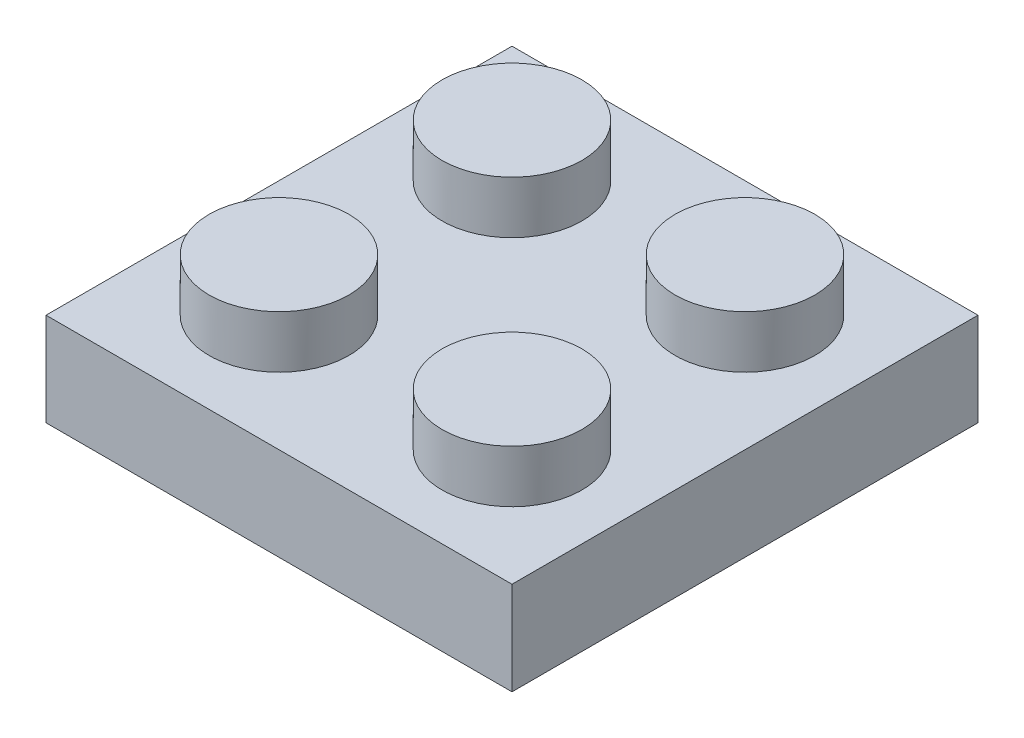
ISO-10303-21;
HEADER;
FILE_DESCRIPTION(('STEP AP214'),'2;1');
FILE_NAME('part.step','',(''),(''),'','','');
FILE_SCHEMA(('AUTOMOTIVE_DESIGN { 1 0 10303 214 1 1 1 1 }'));
ENDSEC;
DATA;
#1=APPLICATION_CONTEXT('core data for automotive mechanical design processes');
#2=APPLICATION_PROTOCOL_DEFINITION('international standard','automotive_design',2000,#1);
#3=PRODUCT_CONTEXT('',#1,'mechanical');
#4=PRODUCT('Part','Part','',(#3));
#5=PRODUCT_RELATED_PRODUCT_CATEGORY('part','',(#4));
#6=PRODUCT_DEFINITION_FORMATION('','',#4);
#7=PRODUCT_DEFINITION_CONTEXT('part definition',#1,'design');
#8=PRODUCT_DEFINITION('design','',#6,#7);
#9=PRODUCT_DEFINITION_SHAPE('','',#8);
#10=(LENGTH_UNIT() NAMED_UNIT(*) SI_UNIT(.MILLI.,.METRE.));
#11=(NAMED_UNIT(*) PLANE_ANGLE_UNIT() SI_UNIT($,.RADIAN.));
#12=(NAMED_UNIT(*) SI_UNIT($,.STERADIAN.) SOLID_ANGLE_UNIT());
#13=UNCERTAINTY_MEASURE_WITH_UNIT(LENGTH_MEASURE(1.E-05),#10,'distance_accuracy_value','');
#14=(GEOMETRIC_REPRESENTATION_CONTEXT(3) GLOBAL_UNCERTAINTY_ASSIGNED_CONTEXT((#13)) GLOBAL_UNIT_ASSIGNED_CONTEXT((#10,
#11,#12)) REPRESENTATION_CONTEXT('',''));
#15=CARTESIAN_POINT('',(0.,0.,0.));
#16=DIRECTION('',(0.,0.,1.));
#17=DIRECTION('',(1.,0.,0.));
#18=AXIS2_PLACEMENT_3D('',#15,#16,#17);
#19=CARTESIAN_POINT('',(0.,3.2,0.));
#20=DIRECTION('',(1.,0.,0.));
#21=DIRECTION('',(0.,0.,-1.));
#22=AXIS2_PLACEMENT_3D('',#19,#20,#21);
#23=PLANE('',#22);
#24=DIRECTION('',(0.,0.,1.));
#25=VECTOR('',#24,1.);
#26=CARTESIAN_POINT('',(0.,0.,0.));
#27=LINE('',#26,#25);
#28=CARTESIAN_POINT('',(0.,0.,-16.));
#29=VERTEX_POINT('',#28);
#30=CARTESIAN_POINT('',(0.,0.,0.));
#31=VERTEX_POINT('',#30);
#32=EDGE_CURVE('E187',#29,#31,#27,.T.);
#33=ORIENTED_EDGE('',*,*,#32,.T.);
#34=DIRECTION('',(0.,-1.,0.));
#35=VECTOR('',#34,1.);
#36=CARTESIAN_POINT('',(0.,3.2,0.));
#37=LINE('',#36,#35);
#38=CARTESIAN_POINT('',(0.,3.2,0.));
#39=VERTEX_POINT('',#38);
#40=EDGE_CURVE('E219',#39,#31,#37,.T.);
#41=ORIENTED_EDGE('',*,*,#40,.F.);
#42=DIRECTION('',(0.,0.,1.));
#43=VECTOR('',#42,1.);
#44=CARTESIAN_POINT('',(0.,3.2,0.));
#45=LINE('',#44,#43);
#46=CARTESIAN_POINT('',(0.,3.2,-16.));
#47=VERTEX_POINT('',#46);
#48=EDGE_CURVE('E188',#47,#39,#45,.T.);
#49=ORIENTED_EDGE('',*,*,#48,.F.);
#50=DIRECTION('',(0.,-1.,0.));
#51=VECTOR('',#50,1.);
#52=CARTESIAN_POINT('',(0.,3.2,-16.));
#53=LINE('',#52,#51);
#54=EDGE_CURVE('E198',#47,#29,#53,.T.);
#55=ORIENTED_EDGE('',*,*,#54,.T.);
#56=EDGE_LOOP('',(#33,#41,#49,#55));
#57=FACE_BOUND('',#56,.T.);
#58=ADVANCED_FACE('F42',(#57),#23,.F.);
#59=CARTESIAN_POINT('',(0.,3.2,0.));
#60=DIRECTION('',(0.,0.,-1.));
#61=DIRECTION('',(-1.,0.,0.));
#62=AXIS2_PLACEMENT_3D('',#59,#60,#61);
#63=PLANE('',#62);
#64=DIRECTION('',(1.,0.,0.));
#65=VECTOR('',#64,1.);
#66=CARTESIAN_POINT('',(0.,0.,0.));
#67=LINE('',#66,#65);
#68=CARTESIAN_POINT('',(16.,0.,0.));
#69=VERTEX_POINT('',#68);
#70=EDGE_CURVE('E202',#31,#69,#67,.T.);
#71=ORIENTED_EDGE('',*,*,#70,.T.);
#72=DIRECTION('',(0.,-1.,0.));
#73=VECTOR('',#72,1.);
#74=CARTESIAN_POINT('',(16.,3.2,0.));
#75=LINE('',#74,#73);
#76=CARTESIAN_POINT('',(16.,3.2,0.));
#77=VERTEX_POINT('',#76);
#78=EDGE_CURVE('E215',#77,#69,#75,.T.);
#79=ORIENTED_EDGE('',*,*,#78,.F.);
#80=DIRECTION('',(1.,0.,0.));
#81=VECTOR('',#80,1.);
#82=CARTESIAN_POINT('',(0.,3.2,0.));
#83=LINE('',#82,#81);
#84=EDGE_CURVE('E95',#39,#77,#83,.T.);
#85=ORIENTED_EDGE('',*,*,#84,.F.);
#86=ORIENTED_EDGE('',*,*,#40,.T.);
#87=EDGE_LOOP('',(#71,#79,#85,#86));
#88=FACE_BOUND('',#87,.T.);
#89=ADVANCED_FACE('F249',(#88),#63,.F.);
#90=CARTESIAN_POINT('',(16.,3.2,0.));
#91=DIRECTION('',(-1.,0.,0.));
#92=DIRECTION('',(0.,0.,1.));
#93=AXIS2_PLACEMENT_3D('',#90,#91,#92);
#94=PLANE('',#93);
#95=DIRECTION('',(0.,0.,-1.));
#96=VECTOR('',#95,1.);
#97=CARTESIAN_POINT('',(16.,0.,0.));
#98=LINE('',#97,#96);
#99=CARTESIAN_POINT('',(16.,0.,-16.));
#100=VERTEX_POINT('',#99);
#101=EDGE_CURVE('E205',#69,#100,#98,.T.);
#102=ORIENTED_EDGE('',*,*,#101,.T.);
#103=DIRECTION('',(0.,-1.,0.));
#104=VECTOR('',#103,1.);
#105=CARTESIAN_POINT('',(16.,3.2,-16.));
#106=LINE('',#105,#104);
#107=CARTESIAN_POINT('',(16.,3.2,-16.));
#108=VERTEX_POINT('',#107);
#109=EDGE_CURVE('E212',#108,#100,#106,.T.);
#110=ORIENTED_EDGE('',*,*,#109,.F.);
#111=DIRECTION('',(0.,0.,-1.));
#112=VECTOR('',#111,1.);
#113=CARTESIAN_POINT('',(16.,3.2,0.));
#114=LINE('',#113,#112);
#115=EDGE_CURVE('E193',#77,#108,#114,.T.);
#116=ORIENTED_EDGE('',*,*,#115,.F.);
#117=ORIENTED_EDGE('',*,*,#78,.T.);
#118=EDGE_LOOP('',(#102,#110,#116,#117));
#119=FACE_BOUND('',#118,.T.);
#120=ADVANCED_FACE('F254',(#119),#94,.F.);
#121=CARTESIAN_POINT('',(0.,3.2,-16.));
#122=DIRECTION('',(0.,0.,1.));
#123=DIRECTION('',(1.,0.,0.));
#124=AXIS2_PLACEMENT_3D('',#121,#122,#123);
#125=PLANE('',#124);
#126=DIRECTION('',(-1.,0.,0.));
#127=VECTOR('',#126,1.);
#128=CARTESIAN_POINT('',(0.,0.,-16.));
#129=LINE('',#128,#127);
#130=EDGE_CURVE('E87',#100,#29,#129,.T.);
#131=ORIENTED_EDGE('',*,*,#130,.T.);
#132=ORIENTED_EDGE('',*,*,#54,.F.);
#133=DIRECTION('',(-1.,0.,0.));
#134=VECTOR('',#133,1.);
#135=CARTESIAN_POINT('',(0.,3.2,-16.));
#136=LINE('',#135,#134);
#137=EDGE_CURVE('E66',#108,#47,#136,.T.);
#138=ORIENTED_EDGE('',*,*,#137,.F.);
#139=ORIENTED_EDGE('',*,*,#109,.T.);
#140=EDGE_LOOP('',(#131,#132,#138,#139));
#141=FACE_BOUND('',#140,.T.);
#142=ADVANCED_FACE('F239',(#141),#125,.F.);
#143=CARTESIAN_POINT('',(0.,3.2,0.));
#144=DIRECTION('',(0.,-1.,0.));
#145=DIRECTION('',(0.,0.,-1.));
#146=AXIS2_PLACEMENT_3D('',#143,#144,#145);
#147=PLANE('',#146);
#148=CARTESIAN_POINT('',(3.99999999999999,3.2,-4.));
#149=DIRECTION('',(0.,-1.,0.));
#150=DIRECTION('',(0.,0.,-1.));
#151=AXIS2_PLACEMENT_3D('',#148,#149,#150);
#152=CIRCLE('',#151,2.4);
#153=CARTESIAN_POINT('',(3.99999999999999,3.2,-6.4));
#154=VERTEX_POINT('',#153);
#155=EDGE_CURVE('E11',#154,#154,#152,.F.);
#156=ORIENTED_EDGE('',*,*,#155,.F.);
#157=EDGE_LOOP('',(#156));
#158=FACE_BOUND('',#157,.T.);
#159=CARTESIAN_POINT('',(12.,3.2,-4.));
#160=DIRECTION('',(0.,-1.,0.));
#161=DIRECTION('',(0.,0.,-1.));
#162=AXIS2_PLACEMENT_3D('',#159,#160,#161);
#163=CIRCLE('',#162,2.4);
#164=CARTESIAN_POINT('',(12.,3.2,-6.4));
#165=VERTEX_POINT('',#164);
#166=EDGE_CURVE('E50',#165,#165,#163,.F.);
#167=ORIENTED_EDGE('',*,*,#166,.F.);
#168=EDGE_LOOP('',(#167));
#169=FACE_BOUND('',#168,.T.);
#170=CARTESIAN_POINT('',(12.,3.2,-12.));
#171=DIRECTION('',(0.,-1.,0.));
#172=DIRECTION('',(0.,0.,-1.));
#173=AXIS2_PLACEMENT_3D('',#170,#171,#172);
#174=CIRCLE('',#173,2.4);
#175=CARTESIAN_POINT('',(12.,3.2,-14.4));
#176=VERTEX_POINT('',#175);
#177=EDGE_CURVE('E226',#176,#176,#174,.F.);
#178=ORIENTED_EDGE('',*,*,#177,.F.);
#179=EDGE_LOOP('',(#178));
#180=FACE_BOUND('',#179,.T.);
#181=CARTESIAN_POINT('',(3.99999999999999,3.2,-12.));
#182=DIRECTION('',(0.,-1.,0.));
#183=DIRECTION('',(0.,0.,-1.));
#184=AXIS2_PLACEMENT_3D('',#181,#182,#183);
#185=CIRCLE('',#184,2.4);
#186=CARTESIAN_POINT('',(3.99999999999999,3.2,-14.4));
#187=VERTEX_POINT('',#186);
#188=EDGE_CURVE('E222',#187,#187,#185,.F.);
#189=ORIENTED_EDGE('',*,*,#188,.F.);
#190=EDGE_LOOP('',(#189));
#191=FACE_BOUND('',#190,.T.);
#192=ORIENTED_EDGE('',*,*,#48,.T.);
#193=ORIENTED_EDGE('',*,*,#84,.T.);
#194=ORIENTED_EDGE('',*,*,#115,.T.);
#195=ORIENTED_EDGE('',*,*,#137,.T.);
#196=EDGE_LOOP('',(#192,#193,#194,#195));
#197=FACE_BOUND('',#196,.T.);
#198=ADVANCED_FACE('F235',(#158,#169,#180,#191,#197),#147,.F.);
#199=CARTESIAN_POINT('',(0.,0.,0.));
#200=DIRECTION('',(0.,-1.,0.));
#201=DIRECTION('',(0.,0.,-1.));
#202=AXIS2_PLACEMENT_3D('',#199,#200,#201);
#203=PLANE('',#202);
#204=DIRECTION('',(0.,0.,-1.));
#205=VECTOR('',#204,1.);
#206=CARTESIAN_POINT('',(1.59999999999999,0.,-1.6));
#207=LINE('',#206,#205);
#208=CARTESIAN_POINT('',(1.59999999999999,0.,-1.6));
#209=VERTEX_POINT('',#208);
#210=CARTESIAN_POINT('',(1.59999999999999,0.,-14.4));
#211=VERTEX_POINT('',#210);
#212=EDGE_CURVE('E57',#209,#211,#207,.T.);
#213=ORIENTED_EDGE('',*,*,#212,.F.);
#214=DIRECTION('',(-1.,0.,0.));
#215=VECTOR('',#214,1.);
#216=CARTESIAN_POINT('',(1.59999999999999,0.,-1.6));
#217=LINE('',#216,#215);
#218=CARTESIAN_POINT('',(14.4,0.,-1.6));
#219=VERTEX_POINT('',#218);
#220=EDGE_CURVE('E140',#219,#209,#217,.T.);
#221=ORIENTED_EDGE('',*,*,#220,.F.);
#222=DIRECTION('',(0.,0.,1.));
#223=VECTOR('',#222,1.);
#224=CARTESIAN_POINT('',(14.4,0.,-1.6));
#225=LINE('',#224,#223);
#226=CARTESIAN_POINT('',(14.4,0.,-14.4));
#227=VERTEX_POINT('',#226);
#228=EDGE_CURVE('E144',#227,#219,#225,.T.);
#229=ORIENTED_EDGE('',*,*,#228,.F.);
#230=DIRECTION('',(1.,0.,0.));
#231=VECTOR('',#230,1.);
#232=CARTESIAN_POINT('',(1.59999999999999,0.,-14.4));
#233=LINE('',#232,#231);
#234=EDGE_CURVE('E156',#211,#227,#233,.T.);
#235=ORIENTED_EDGE('',*,*,#234,.F.);
#236=EDGE_LOOP('',(#213,#221,#229,#235));
#237=FACE_BOUND('',#236,.T.);
#238=ORIENTED_EDGE('',*,*,#32,.F.);
#239=ORIENTED_EDGE('',*,*,#130,.F.);
#240=ORIENTED_EDGE('',*,*,#101,.F.);
#241=ORIENTED_EDGE('',*,*,#70,.F.);
#242=EDGE_LOOP('',(#238,#239,#240,#241));
#243=FACE_BOUND('',#242,.T.);
#244=ADVANCED_FACE('F238',(#237,#243),#203,.T.);
#245=CARTESIAN_POINT('',(3.99999999999999,5.,-12.));
#246=DIRECTION('',(0.,-1.,0.));
#247=DIRECTION('',(0.,0.,-1.));
#248=AXIS2_PLACEMENT_3D('',#245,#246,#247);
#249=CYLINDRICAL_SURFACE('',#248,2.4);
#250=CARTESIAN_POINT('',(3.99999999999999,5.,-12.));
#251=DIRECTION('',(0.,1.,0.));
#252=DIRECTION('',(0.,0.,1.));
#253=AXIS2_PLACEMENT_3D('',#250,#251,#252);
#254=CIRCLE('',#253,2.4);
#255=CARTESIAN_POINT('',(3.99999999999999,5.,-9.6));
#256=VERTEX_POINT('',#255);
#257=EDGE_CURVE('E183',#256,#256,#254,.T.);
#258=ORIENTED_EDGE('',*,*,#257,.F.);
#259=EDGE_LOOP('',(#258));
#260=FACE_BOUND('',#259,.T.);
#261=ORIENTED_EDGE('',*,*,#188,.T.);
#262=EDGE_LOOP('',(#261));
#263=FACE_BOUND('',#262,.T.);
#264=ADVANCED_FACE('F257',(#260,#263),#249,.T.);
#265=CARTESIAN_POINT('',(3.99999999999999,5.,-12.));
#266=DIRECTION('',(0.,1.,0.));
#267=DIRECTION('',(0.,0.,1.));
#268=AXIS2_PLACEMENT_3D('',#265,#266,#267);
#269=PLANE('',#268);
#270=ORIENTED_EDGE('',*,*,#257,.T.);
#271=EDGE_LOOP('',(#270));
#272=FACE_BOUND('',#271,.T.);
#273=ADVANCED_FACE('F263',(#272),#269,.T.);
#274=CARTESIAN_POINT('',(12.,5.,-12.));
#275=DIRECTION('',(0.,-1.,0.));
#276=DIRECTION('',(0.,0.,-1.));
#277=AXIS2_PLACEMENT_3D('',#274,#275,#276);
#278=CYLINDRICAL_SURFACE('',#277,2.4);
#279=CARTESIAN_POINT('',(12.,5.,-12.));
#280=DIRECTION('',(0.,1.,0.));
#281=DIRECTION('',(0.,0.,1.));
#282=AXIS2_PLACEMENT_3D('',#279,#280,#281);
#283=CIRCLE('',#282,2.4);
#284=CARTESIAN_POINT('',(12.,5.,-9.6));
#285=VERTEX_POINT('',#284);
#286=EDGE_CURVE('E179',#285,#285,#283,.T.);
#287=ORIENTED_EDGE('',*,*,#286,.F.);
#288=EDGE_LOOP('',(#287));
#289=FACE_BOUND('',#288,.T.);
#290=ORIENTED_EDGE('',*,*,#177,.T.);
#291=EDGE_LOOP('',(#290));
#292=FACE_BOUND('',#291,.T.);
#293=ADVANCED_FACE('F302',(#289,#292),#278,.T.);
#294=CARTESIAN_POINT('',(12.,5.,-12.));
#295=DIRECTION('',(0.,1.,0.));
#296=DIRECTION('',(0.,0.,1.));
#297=AXIS2_PLACEMENT_3D('',#294,#295,#296);
#298=PLANE('',#297);
#299=ORIENTED_EDGE('',*,*,#286,.T.);
#300=EDGE_LOOP('',(#299));
#301=FACE_BOUND('',#300,.T.);
#302=ADVANCED_FACE('F313',(#301),#298,.T.);
#303=CARTESIAN_POINT('',(12.,5.,-4.));
#304=DIRECTION('',(0.,-1.,0.));
#305=DIRECTION('',(0.,0.,-1.));
#306=AXIS2_PLACEMENT_3D('',#303,#304,#305);
#307=CYLINDRICAL_SURFACE('',#306,2.4);
#308=CARTESIAN_POINT('',(12.,5.,-4.));
#309=DIRECTION('',(0.,1.,0.));
#310=DIRECTION('',(0.,0.,1.));
#311=AXIS2_PLACEMENT_3D('',#308,#309,#310);
#312=CIRCLE('',#311,2.4);
#313=CARTESIAN_POINT('',(12.,5.,-1.6));
#314=VERTEX_POINT('',#313);
#315=EDGE_CURVE('E175',#314,#314,#312,.T.);
#316=ORIENTED_EDGE('',*,*,#315,.F.);
#317=EDGE_LOOP('',(#316));
#318=FACE_BOUND('',#317,.T.);
#319=ORIENTED_EDGE('',*,*,#166,.T.);
#320=EDGE_LOOP('',(#319));
#321=FACE_BOUND('',#320,.T.);
#322=ADVANCED_FACE('F233',(#318,#321),#307,.T.);
#323=CARTESIAN_POINT('',(12.,5.,-4.));
#324=DIRECTION('',(0.,1.,0.));
#325=DIRECTION('',(0.,0.,1.));
#326=AXIS2_PLACEMENT_3D('',#323,#324,#325);
#327=PLANE('',#326);
#328=ORIENTED_EDGE('',*,*,#315,.T.);
#329=EDGE_LOOP('',(#328));
#330=FACE_BOUND('',#329,.T.);
#331=ADVANCED_FACE('F334',(#330),#327,.T.);
#332=CARTESIAN_POINT('',(3.99999999999999,5.,-4.));
#333=DIRECTION('',(0.,-1.,0.));
#334=DIRECTION('',(0.,0.,-1.));
#335=AXIS2_PLACEMENT_3D('',#332,#333,#334);
#336=CYLINDRICAL_SURFACE('',#335,2.4);
#337=CARTESIAN_POINT('',(3.99999999999999,5.,-4.));
#338=DIRECTION('',(0.,1.,0.));
#339=DIRECTION('',(0.,0.,1.));
#340=AXIS2_PLACEMENT_3D('',#337,#338,#339);
#341=CIRCLE('',#340,2.4);
#342=CARTESIAN_POINT('',(3.99999999999999,5.,-1.6));
#343=VERTEX_POINT('',#342);
#344=EDGE_CURVE('E166',#343,#343,#341,.T.);
#345=ORIENTED_EDGE('',*,*,#344,.F.);
#346=EDGE_LOOP('',(#345));
#347=FACE_BOUND('',#346,.T.);
#348=ORIENTED_EDGE('',*,*,#155,.T.);
#349=EDGE_LOOP('',(#348));
#350=FACE_BOUND('',#349,.T.);
#351=ADVANCED_FACE('F345',(#347,#350),#336,.T.);
#352=CARTESIAN_POINT('',(3.99999999999999,5.,-4.));
#353=DIRECTION('',(0.,1.,0.));
#354=DIRECTION('',(0.,0.,1.));
#355=AXIS2_PLACEMENT_3D('',#352,#353,#354);
#356=PLANE('',#355);
#357=ORIENTED_EDGE('',*,*,#344,.T.);
#358=EDGE_LOOP('',(#357));
#359=FACE_BOUND('',#358,.T.);
#360=ADVANCED_FACE('F356',(#359),#356,.T.);
#361=CARTESIAN_POINT('',(1.59999999999999,1.8,-1.6));
#362=DIRECTION('',(-1.,0.,0.));
#363=DIRECTION('',(0.,0.,1.));
#364=AXIS2_PLACEMENT_3D('',#361,#362,#363);
#365=PLANE('',#364);
#366=ORIENTED_EDGE('',*,*,#212,.T.);
#367=DIRECTION('',(0.,-1.,0.));
#368=VECTOR('',#367,1.);
#369=CARTESIAN_POINT('',(1.59999999999999,1.8,-14.4));
#370=LINE('',#369,#368);
#371=CARTESIAN_POINT('',(1.59999999999999,1.8,-14.4));
#372=VERTEX_POINT('',#371);
#373=EDGE_CURVE('E115',#372,#211,#370,.T.);
#374=ORIENTED_EDGE('',*,*,#373,.F.);
#375=DIRECTION('',(0.,0.,-1.));
#376=VECTOR('',#375,1.);
#377=CARTESIAN_POINT('',(1.59999999999999,1.8,-1.6));
#378=LINE('',#377,#376);
#379=CARTESIAN_POINT('',(1.59999999999999,1.8,-1.6));
#380=VERTEX_POINT('',#379);
#381=EDGE_CURVE('E119',#380,#372,#378,.T.);
#382=ORIENTED_EDGE('',*,*,#381,.F.);
#383=DIRECTION('',(0.,-1.,0.));
#384=VECTOR('',#383,1.);
#385=CARTESIAN_POINT('',(1.59999999999999,1.8,-1.6));
#386=LINE('',#385,#384);
#387=EDGE_CURVE('E163',#380,#209,#386,.T.);
#388=ORIENTED_EDGE('',*,*,#387,.T.);
#389=EDGE_LOOP('',(#366,#374,#382,#388));
#390=FACE_BOUND('',#389,.T.);
#391=ADVANCED_FACE('F117',(#390),#365,.F.);
#392=CARTESIAN_POINT('',(1.59999999999999,1.8,-1.6));
#393=DIRECTION('',(0.,0.,1.));
#394=DIRECTION('',(1.,0.,0.));
#395=AXIS2_PLACEMENT_3D('',#392,#393,#394);
#396=PLANE('',#395);
#397=ORIENTED_EDGE('',*,*,#220,.T.);
#398=ORIENTED_EDGE('',*,*,#387,.F.);
#399=DIRECTION('',(-1.,0.,0.));
#400=VECTOR('',#399,1.);
#401=CARTESIAN_POINT('',(1.59999999999999,1.8,-1.6));
#402=LINE('',#401,#400);
#403=CARTESIAN_POINT('',(14.4,1.8,-1.6));
#404=VERTEX_POINT('',#403);
#405=EDGE_CURVE('E126',#404,#380,#402,.T.);
#406=ORIENTED_EDGE('',*,*,#405,.F.);
#407=DIRECTION('',(0.,-1.,0.));
#408=VECTOR('',#407,1.);
#409=CARTESIAN_POINT('',(14.4,1.8,-1.6));
#410=LINE('',#409,#408);
#411=EDGE_CURVE('E167',#404,#219,#410,.T.);
#412=ORIENTED_EDGE('',*,*,#411,.T.);
#413=EDGE_LOOP('',(#397,#398,#406,#412));
#414=FACE_BOUND('',#413,.T.);
#415=ADVANCED_FACE('F381',(#414),#396,.F.);
#416=CARTESIAN_POINT('',(14.4,1.8,-1.6));
#417=DIRECTION('',(1.,0.,0.));
#418=DIRECTION('',(0.,0.,-1.));
#419=AXIS2_PLACEMENT_3D('',#416,#417,#418);
#420=PLANE('',#419);
#421=ORIENTED_EDGE('',*,*,#228,.T.);
#422=ORIENTED_EDGE('',*,*,#411,.F.);
#423=DIRECTION('',(0.,0.,1.));
#424=VECTOR('',#423,1.);
#425=CARTESIAN_POINT('',(14.4,1.8,-1.6));
#426=LINE('',#425,#424);
#427=CARTESIAN_POINT('',(14.4,1.8,-14.4));
#428=VERTEX_POINT('',#427);
#429=EDGE_CURVE('E135',#428,#404,#426,.T.);
#430=ORIENTED_EDGE('',*,*,#429,.F.);
#431=DIRECTION('',(0.,-1.,0.));
#432=VECTOR('',#431,1.);
#433=CARTESIAN_POINT('',(14.4,1.8,-14.4));
#434=LINE('',#433,#432);
#435=EDGE_CURVE('E125',#428,#227,#434,.T.);
#436=ORIENTED_EDGE('',*,*,#435,.T.);
#437=EDGE_LOOP('',(#421,#422,#430,#436));
#438=FACE_BOUND('',#437,.T.);
#439=ADVANCED_FACE('F391',(#438),#420,.F.);
#440=CARTESIAN_POINT('',(1.59999999999999,1.8,-14.4));
#441=DIRECTION('',(0.,0.,-1.));
#442=DIRECTION('',(-1.,0.,0.));
#443=AXIS2_PLACEMENT_3D('',#440,#441,#442);
#444=PLANE('',#443);
#445=ORIENTED_EDGE('',*,*,#234,.T.);
#446=ORIENTED_EDGE('',*,*,#435,.F.);
#447=DIRECTION('',(1.,0.,0.));
#448=VECTOR('',#447,1.);
#449=CARTESIAN_POINT('',(1.59999999999999,1.8,-14.4));
#450=LINE('',#449,#448);
#451=EDGE_CURVE('E129',#372,#428,#450,.T.);
#452=ORIENTED_EDGE('',*,*,#451,.F.);
#453=ORIENTED_EDGE('',*,*,#373,.T.);
#454=EDGE_LOOP('',(#445,#446,#452,#453));
#455=FACE_BOUND('',#454,.T.);
#456=ADVANCED_FACE('F130',(#455),#444,.F.);
#457=CARTESIAN_POINT('',(0.,1.8,0.));
#458=DIRECTION('',(0.,-1.,0.));
#459=DIRECTION('',(0.,0.,-1.));
#460=AXIS2_PLACEMENT_3D('',#457,#458,#459);
#461=PLANE('',#460);
#462=CARTESIAN_POINT('',(7.99999999999999,1.8,-8.));
#463=DIRECTION('',(0.,-1.,0.));
#464=DIRECTION('',(0.,0.,-1.));
#465=AXIS2_PLACEMENT_3D('',#462,#463,#464);
#466=CIRCLE('',#465,3.25685425);
#467=CARTESIAN_POINT('',(7.99999999999999,1.8,-11.25685425));
#468=VERTEX_POINT('',#467);
#469=EDGE_CURVE('E147',#468,#468,#466,.T.);
#470=ORIENTED_EDGE('',*,*,#469,.F.);
#471=EDGE_LOOP('',(#470));
#472=FACE_BOUND('',#471,.T.);
#473=ORIENTED_EDGE('',*,*,#381,.T.);
#474=ORIENTED_EDGE('',*,*,#451,.T.);
#475=ORIENTED_EDGE('',*,*,#429,.T.);
#476=ORIENTED_EDGE('',*,*,#405,.T.);
#477=EDGE_LOOP('',(#473,#474,#475,#476));
#478=FACE_BOUND('',#477,.T.);
#479=ADVANCED_FACE('F137',(#472,#478),#461,.T.);
#480=CARTESIAN_POINT('',(7.99999999999999,0.,-8.));
#481=DIRECTION('',(0.,1.,0.));
#482=DIRECTION('',(0.,0.,1.));
#483=AXIS2_PLACEMENT_3D('',#480,#481,#482);
#484=CYLINDRICAL_SURFACE('',#483,3.25685425);
#485=CARTESIAN_POINT('',(7.99999999999999,0.,-8.));
#486=DIRECTION('',(0.,-1.,0.));
#487=DIRECTION('',(0.,0.,-1.));
#488=AXIS2_PLACEMENT_3D('',#485,#486,#487);
#489=CIRCLE('',#488,3.25685425);
#490=CARTESIAN_POINT('',(7.99999999999999,0.,-11.25685425));
#491=VERTEX_POINT('',#490);
#492=EDGE_CURVE('E157',#491,#491,#489,.T.);
#493=ORIENTED_EDGE('',*,*,#492,.F.);
#494=EDGE_LOOP('',(#493));
#495=FACE_BOUND('',#494,.T.);
#496=ORIENTED_EDGE('',*,*,#469,.T.);
#497=EDGE_LOOP('',(#496));
#498=FACE_BOUND('',#497,.T.);
#499=ADVANCED_FACE('F421',(#495,#498),#484,.T.);
#500=CARTESIAN_POINT('',(7.99999999999999,0.,-8.));
#501=DIRECTION('',(0.,-1.,0.));
#502=DIRECTION('',(0.,0.,-1.));
#503=AXIS2_PLACEMENT_3D('',#500,#501,#502);
#504=PLANE('',#503);
#505=CARTESIAN_POINT('',(7.99999999999999,0.,-8.));
#506=DIRECTION('',(0.,-1.,0.));
#507=DIRECTION('',(0.,0.,-1.));
#508=AXIS2_PLACEMENT_3D('',#505,#506,#507);
#509=CIRCLE('',#508,2.45685425);
#510=CARTESIAN_POINT('',(7.99999999999999,0.,-10.45685425));
#511=VERTEX_POINT('',#510);
#512=EDGE_CURVE('E515',#511,#511,#509,.T.);
#513=ORIENTED_EDGE('',*,*,#512,.F.);
#514=EDGE_LOOP('',(#513));
#515=FACE_BOUND('',#514,.T.);
#516=ORIENTED_EDGE('',*,*,#492,.T.);
#517=EDGE_LOOP('',(#516));
#518=FACE_BOUND('',#517,.T.);
#519=ADVANCED_FACE('F432',(#515,#518),#504,.T.);
#520=CARTESIAN_POINT('',(7.99999999999999,1.8,-8.));
#521=DIRECTION('',(0.,-1.,0.));
#522=DIRECTION('',(0.,0.,-1.));
#523=AXIS2_PLACEMENT_3D('',#520,#521,#522);
#524=CYLINDRICAL_SURFACE('',#523,2.45685425);
#525=CARTESIAN_POINT('',(7.99999999999999,1.8,-8.));
#526=DIRECTION('',(0.,-1.,0.));
#527=DIRECTION('',(0.,0.,-1.));
#528=AXIS2_PLACEMENT_3D('',#525,#526,#527);
#529=CIRCLE('',#528,2.45685425);
#530=CARTESIAN_POINT('',(7.99999999999999,1.8,-10.45685425));
#531=VERTEX_POINT('',#530);
#532=EDGE_CURVE('E513',#531,#531,#529,.T.);
#533=ORIENTED_EDGE('',*,*,#532,.F.);
#534=EDGE_LOOP('',(#533));
#535=FACE_BOUND('',#534,.T.);
#536=ORIENTED_EDGE('',*,*,#512,.T.);
#537=EDGE_LOOP('',(#536));
#538=FACE_BOUND('',#537,.T.);
#539=ADVANCED_FACE('F443',(#535,#538),#524,.F.);
#540=CARTESIAN_POINT('',(7.99999999999999,1.8,-8.));
#541=DIRECTION('',(0.,-1.,0.));
#542=DIRECTION('',(0.,0.,-1.));
#543=AXIS2_PLACEMENT_3D('',#540,#541,#542);
#544=PLANE('',#543);
#545=ORIENTED_EDGE('',*,*,#532,.T.);
#546=EDGE_LOOP('',(#545));
#547=FACE_BOUND('',#546,.T.);
#548=ADVANCED_FACE('F454',(#547),#544,.T.);
#549=CLOSED_SHELL('',(#58,#89,#120,#142,#198,#244,#264,#273,#293,#302,#322,#331,#351,#360,#391,
#415,#439,#456,#479,#499,#519,#539,#548));
#550=MANIFOLD_SOLID_BREP('B2',#549);
#551=ADVANCED_BREP_SHAPE_REPRESENTATION('',(#18,#550),#14);
#552=SHAPE_DEFINITION_REPRESENTATION(#9,#551);
ENDSEC;
END-ISO-10303-21;
